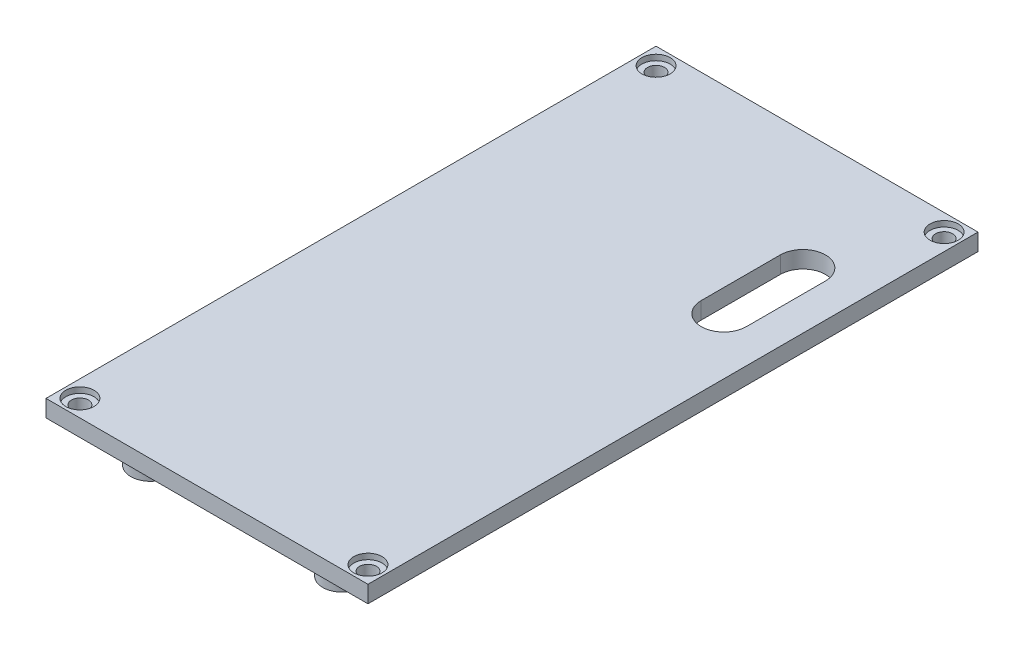
ISO-10303-21;
HEADER;
FILE_DESCRIPTION(('STEP AP214'),'2;1');
FILE_NAME('part.step','',(''),(''),'','','');
FILE_SCHEMA(('AUTOMOTIVE_DESIGN { 1 0 10303 214 1 1 1 1 }'));
ENDSEC;
DATA;
#1=APPLICATION_CONTEXT('core data for automotive mechanical design processes');
#2=APPLICATION_PROTOCOL_DEFINITION('international standard','automotive_design',2000,#1);
#3=PRODUCT_CONTEXT('',#1,'mechanical');
#4=PRODUCT('Part','Part','',(#3));
#5=PRODUCT_RELATED_PRODUCT_CATEGORY('part','',(#4));
#6=PRODUCT_DEFINITION_FORMATION('','',#4);
#7=PRODUCT_DEFINITION_CONTEXT('part definition',#1,'design');
#8=PRODUCT_DEFINITION('design','',#6,#7);
#9=PRODUCT_DEFINITION_SHAPE('','',#8);
#10=(LENGTH_UNIT() NAMED_UNIT(*) SI_UNIT(.MILLI.,.METRE.));
#11=(NAMED_UNIT(*) PLANE_ANGLE_UNIT() SI_UNIT($,.RADIAN.));
#12=(NAMED_UNIT(*) SI_UNIT($,.STERADIAN.) SOLID_ANGLE_UNIT());
#13=UNCERTAINTY_MEASURE_WITH_UNIT(LENGTH_MEASURE(1.E-05),#10,'distance_accuracy_value','');
#14=(GEOMETRIC_REPRESENTATION_CONTEXT(3) GLOBAL_UNCERTAINTY_ASSIGNED_CONTEXT((#13)) GLOBAL_UNIT_ASSIGNED_CONTEXT((#10,
#11,#12)) REPRESENTATION_CONTEXT('',''));
#15=CARTESIAN_POINT('',(0.,0.,0.));
#16=DIRECTION('',(0.,0.,1.));
#17=DIRECTION('',(1.,0.,0.));
#18=AXIS2_PLACEMENT_3D('',#15,#16,#17);
#19=CARTESIAN_POINT('',(-25.5,0.,-51.));
#20=DIRECTION('',(0.,1.,0.));
#21=DIRECTION('',(0.,0.,1.));
#22=AXIS2_PLACEMENT_3D('',#19,#20,#21);
#23=CYLINDRICAL_SURFACE('',#22,1.5);
#24=CARTESIAN_POINT('',(-25.5,0.,-51.));
#25=DIRECTION('',(0.,1.,0.));
#26=DIRECTION('',(0.,0.,1.));
#27=AXIS2_PLACEMENT_3D('',#24,#25,#26);
#28=CIRCLE('',#27,1.5);
#29=CARTESIAN_POINT('',(-25.5,0.,-49.5));
#30=VERTEX_POINT('',#29);
#31=EDGE_CURVE('E236',#30,#30,#28,.T.);
#32=ORIENTED_EDGE('',*,*,#31,.F.);
#33=EDGE_LOOP('',(#32));
#34=FACE_BOUND('',#33,.T.);
#35=CARTESIAN_POINT('',(-25.5,2.,-51.));
#36=DIRECTION('',(0.,1.,0.));
#37=DIRECTION('',(0.,0.,1.));
#38=AXIS2_PLACEMENT_3D('',#35,#36,#37);
#39=CIRCLE('',#38,1.5);
#40=CARTESIAN_POINT('',(-25.5,2.,-49.5));
#41=VERTEX_POINT('',#40);
#42=EDGE_CURVE('E245',#41,#41,#39,.F.);
#43=ORIENTED_EDGE('',*,*,#42,.F.);
#44=EDGE_LOOP('',(#43));
#45=FACE_BOUND('',#44,.T.);
#46=ADVANCED_FACE('F50',(#34,#45),#23,.F.);
#47=CARTESIAN_POINT('',(25.5,0.,-51.));
#48=DIRECTION('',(0.,1.,0.));
#49=DIRECTION('',(0.,0.,1.));
#50=AXIS2_PLACEMENT_3D('',#47,#48,#49);
#51=CYLINDRICAL_SURFACE('',#50,1.5);
#52=CARTESIAN_POINT('',(25.5,0.,-51.));
#53=DIRECTION('',(0.,1.,0.));
#54=DIRECTION('',(0.,0.,1.));
#55=AXIS2_PLACEMENT_3D('',#52,#53,#54);
#56=CIRCLE('',#55,1.5);
#57=CARTESIAN_POINT('',(25.5,0.,-49.5));
#58=VERTEX_POINT('',#57);
#59=EDGE_CURVE('E232',#58,#58,#56,.T.);
#60=ORIENTED_EDGE('',*,*,#59,.F.);
#61=EDGE_LOOP('',(#60));
#62=FACE_BOUND('',#61,.T.);
#63=CARTESIAN_POINT('',(25.5,2.,-51.));
#64=DIRECTION('',(0.,1.,0.));
#65=DIRECTION('',(0.,0.,1.));
#66=AXIS2_PLACEMENT_3D('',#63,#64,#65);
#67=CIRCLE('',#66,1.5);
#68=CARTESIAN_POINT('',(25.5,2.,-49.5));
#69=VERTEX_POINT('',#68);
#70=EDGE_CURVE('E299',#69,#69,#67,.F.);
#71=ORIENTED_EDGE('',*,*,#70,.F.);
#72=EDGE_LOOP('',(#71));
#73=FACE_BOUND('',#72,.T.);
#74=ADVANCED_FACE('F349',(#62,#73),#51,.F.);
#75=CARTESIAN_POINT('',(25.5,0.,51.));
#76=DIRECTION('',(0.,1.,0.));
#77=DIRECTION('',(0.,0.,1.));
#78=AXIS2_PLACEMENT_3D('',#75,#76,#77);
#79=CYLINDRICAL_SURFACE('',#78,1.5);
#80=CARTESIAN_POINT('',(25.5,0.,51.));
#81=DIRECTION('',(0.,1.,0.));
#82=DIRECTION('',(0.,0.,1.));
#83=AXIS2_PLACEMENT_3D('',#80,#81,#82);
#84=CIRCLE('',#83,1.5);
#85=CARTESIAN_POINT('',(25.5,0.,52.5));
#86=VERTEX_POINT('',#85);
#87=EDGE_CURVE('E237',#86,#86,#84,.T.);
#88=ORIENTED_EDGE('',*,*,#87,.F.);
#89=EDGE_LOOP('',(#88));
#90=FACE_BOUND('',#89,.T.);
#91=CARTESIAN_POINT('',(25.5,2.,51.));
#92=DIRECTION('',(0.,1.,0.));
#93=DIRECTION('',(0.,0.,1.));
#94=AXIS2_PLACEMENT_3D('',#91,#92,#93);
#95=CIRCLE('',#94,1.5);
#96=CARTESIAN_POINT('',(25.5,2.,52.5));
#97=VERTEX_POINT('',#96);
#98=EDGE_CURVE('E295',#97,#97,#95,.F.);
#99=ORIENTED_EDGE('',*,*,#98,.F.);
#100=EDGE_LOOP('',(#99));
#101=FACE_BOUND('',#100,.T.);
#102=ADVANCED_FACE('F355',(#90,#101),#79,.F.);
#103=CARTESIAN_POINT('',(-25.5,0.,51.));
#104=DIRECTION('',(0.,1.,0.));
#105=DIRECTION('',(0.,0.,1.));
#106=AXIS2_PLACEMENT_3D('',#103,#104,#105);
#107=CYLINDRICAL_SURFACE('',#106,1.5);
#108=CARTESIAN_POINT('',(-25.5,0.,51.));
#109=DIRECTION('',(0.,1.,0.));
#110=DIRECTION('',(0.,0.,1.));
#111=AXIS2_PLACEMENT_3D('',#108,#109,#110);
#112=CIRCLE('',#111,1.5);
#113=CARTESIAN_POINT('',(-25.5,0.,52.5));
#114=VERTEX_POINT('',#113);
#115=EDGE_CURVE('E241',#114,#114,#112,.T.);
#116=ORIENTED_EDGE('',*,*,#115,.F.);
#117=EDGE_LOOP('',(#116));
#118=FACE_BOUND('',#117,.T.);
#119=CARTESIAN_POINT('',(-25.5,2.,51.));
#120=DIRECTION('',(0.,1.,0.));
#121=DIRECTION('',(0.,0.,1.));
#122=AXIS2_PLACEMENT_3D('',#119,#120,#121);
#123=CIRCLE('',#122,1.5);
#124=CARTESIAN_POINT('',(-25.5,2.,52.5));
#125=VERTEX_POINT('',#124);
#126=EDGE_CURVE('E228',#125,#125,#123,.F.);
#127=ORIENTED_EDGE('',*,*,#126,.F.);
#128=EDGE_LOOP('',(#127));
#129=FACE_BOUND('',#128,.T.);
#130=ADVANCED_FACE('F362',(#118,#129),#107,.F.);
#131=CARTESIAN_POINT('',(-28.5,3.,-54.));
#132=DIRECTION('',(1.,0.,0.));
#133=DIRECTION('',(0.,0.,-1.));
#134=AXIS2_PLACEMENT_3D('',#131,#132,#133);
#135=PLANE('',#134);
#136=DIRECTION('',(0.,0.,1.));
#137=VECTOR('',#136,1.);
#138=CARTESIAN_POINT('',(-28.5,0.,-54.));
#139=LINE('',#138,#137);
#140=CARTESIAN_POINT('',(-28.5,0.,-54.));
#141=VERTEX_POINT('',#140);
#142=CARTESIAN_POINT('',(-28.5,0.,54.));
#143=VERTEX_POINT('',#142);
#144=EDGE_CURVE('E249',#141,#143,#139,.T.);
#145=ORIENTED_EDGE('',*,*,#144,.T.);
#146=DIRECTION('',(0.,-1.,0.));
#147=VECTOR('',#146,1.);
#148=CARTESIAN_POINT('',(-28.5,3.,54.));
#149=LINE('',#148,#147);
#150=CARTESIAN_POINT('',(-28.5,3.,54.));
#151=VERTEX_POINT('',#150);
#152=EDGE_CURVE('E287',#151,#143,#149,.T.);
#153=ORIENTED_EDGE('',*,*,#152,.F.);
#154=DIRECTION('',(0.,0.,1.));
#155=VECTOR('',#154,1.);
#156=CARTESIAN_POINT('',(-28.5,3.,-54.));
#157=LINE('',#156,#155);
#158=CARTESIAN_POINT('',(-28.5,3.,-54.));
#159=VERTEX_POINT('',#158);
#160=EDGE_CURVE('E250',#159,#151,#157,.T.);
#161=ORIENTED_EDGE('',*,*,#160,.F.);
#162=DIRECTION('',(0.,-1.,0.));
#163=VECTOR('',#162,1.);
#164=CARTESIAN_POINT('',(-28.5,3.,-54.));
#165=LINE('',#164,#163);
#166=EDGE_CURVE('E264',#159,#141,#165,.T.);
#167=ORIENTED_EDGE('',*,*,#166,.T.);
#168=EDGE_LOOP('',(#145,#153,#161,#167));
#169=FACE_BOUND('',#168,.T.);
#170=ADVANCED_FACE('F52',(#169),#135,.F.);
#171=CARTESIAN_POINT('',(-28.5,3.,54.));
#172=DIRECTION('',(0.,0.,-1.));
#173=DIRECTION('',(-1.,0.,0.));
#174=AXIS2_PLACEMENT_3D('',#171,#172,#173);
#175=PLANE('',#174);
#176=DIRECTION('',(1.,0.,0.));
#177=VECTOR('',#176,1.);
#178=CARTESIAN_POINT('',(-28.5,0.,54.));
#179=LINE('',#178,#177);
#180=CARTESIAN_POINT('',(28.5,0.,54.));
#181=VERTEX_POINT('',#180);
#182=EDGE_CURVE('E268',#143,#181,#179,.T.);
#183=ORIENTED_EDGE('',*,*,#182,.T.);
#184=DIRECTION('',(0.,-1.,0.));
#185=VECTOR('',#184,1.);
#186=CARTESIAN_POINT('',(28.5,3.,54.));
#187=LINE('',#186,#185);
#188=CARTESIAN_POINT('',(28.5,3.,54.));
#189=VERTEX_POINT('',#188);
#190=EDGE_CURVE('E283',#189,#181,#187,.T.);
#191=ORIENTED_EDGE('',*,*,#190,.F.);
#192=DIRECTION('',(1.,0.,0.));
#193=VECTOR('',#192,1.);
#194=CARTESIAN_POINT('',(-28.5,3.,54.));
#195=LINE('',#194,#193);
#196=EDGE_CURVE('E254',#151,#189,#195,.T.);
#197=ORIENTED_EDGE('',*,*,#196,.F.);
#198=ORIENTED_EDGE('',*,*,#152,.T.);
#199=EDGE_LOOP('',(#183,#191,#197,#198));
#200=FACE_BOUND('',#199,.T.);
#201=ADVANCED_FACE('F375',(#200),#175,.F.);
#202=CARTESIAN_POINT('',(28.5,3.,-54.));
#203=DIRECTION('',(-1.,0.,0.));
#204=DIRECTION('',(0.,0.,1.));
#205=AXIS2_PLACEMENT_3D('',#202,#203,#204);
#206=PLANE('',#205);
#207=DIRECTION('',(0.,0.,-1.));
#208=VECTOR('',#207,1.);
#209=CARTESIAN_POINT('',(28.5,0.,-54.));
#210=LINE('',#209,#208);
#211=CARTESIAN_POINT('',(28.5,0.,-54.));
#212=VERTEX_POINT('',#211);
#213=EDGE_CURVE('E271',#181,#212,#210,.T.);
#214=ORIENTED_EDGE('',*,*,#213,.T.);
#215=DIRECTION('',(0.,-1.,0.));
#216=VECTOR('',#215,1.);
#217=CARTESIAN_POINT('',(28.5,3.,-54.));
#218=LINE('',#217,#216);
#219=CARTESIAN_POINT('',(28.5,3.,-54.));
#220=VERTEX_POINT('',#219);
#221=EDGE_CURVE('E279',#220,#212,#218,.T.);
#222=ORIENTED_EDGE('',*,*,#221,.F.);
#223=DIRECTION('',(0.,0.,-1.));
#224=VECTOR('',#223,1.);
#225=CARTESIAN_POINT('',(28.5,3.,-54.));
#226=LINE('',#225,#224);
#227=EDGE_CURVE('E258',#189,#220,#226,.T.);
#228=ORIENTED_EDGE('',*,*,#227,.F.);
#229=ORIENTED_EDGE('',*,*,#190,.T.);
#230=EDGE_LOOP('',(#214,#222,#228,#229));
#231=FACE_BOUND('',#230,.T.);
#232=ADVANCED_FACE('F372',(#231),#206,.F.);
#233=CARTESIAN_POINT('',(-28.5,3.,-54.));
#234=DIRECTION('',(0.,0.,1.));
#235=DIRECTION('',(1.,0.,0.));
#236=AXIS2_PLACEMENT_3D('',#233,#234,#235);
#237=PLANE('',#236);
#238=DIRECTION('',(-1.,0.,0.));
#239=VECTOR('',#238,1.);
#240=CARTESIAN_POINT('',(-28.5,0.,-54.));
#241=LINE('',#240,#239);
#242=EDGE_CURVE('E255',#212,#141,#241,.T.);
#243=ORIENTED_EDGE('',*,*,#242,.T.);
#244=ORIENTED_EDGE('',*,*,#166,.F.);
#245=DIRECTION('',(-1.,0.,0.));
#246=VECTOR('',#245,1.);
#247=CARTESIAN_POINT('',(-28.5,3.,-54.));
#248=LINE('',#247,#246);
#249=EDGE_CURVE('E261',#220,#159,#248,.T.);
#250=ORIENTED_EDGE('',*,*,#249,.F.);
#251=ORIENTED_EDGE('',*,*,#221,.T.);
#252=EDGE_LOOP('',(#243,#244,#250,#251));
#253=FACE_BOUND('',#252,.T.);
#254=ADVANCED_FACE('F365',(#253),#237,.F.);
#255=CARTESIAN_POINT('',(0.,3.,0.));
#256=DIRECTION('',(0.,1.,0.));
#257=DIRECTION('',(0.,0.,1.));
#258=AXIS2_PLACEMENT_3D('',#255,#256,#257);
#259=PLANE('',#258);
#260=CARTESIAN_POINT('',(18.5,3.,-33.));
#261=DIRECTION('',(0.,1.,0.));
#262=DIRECTION('',(0.,0.,1.));
#263=AXIS2_PLACEMENT_3D('',#260,#261,#262);
#264=CIRCLE('',#263,4.);
#265=CARTESIAN_POINT('',(22.5,3.,-33.));
#266=VERTEX_POINT('',#265);
#267=CARTESIAN_POINT('',(14.5,3.,-33.));
#268=VERTEX_POINT('',#267);
#269=EDGE_CURVE('E66',#266,#268,#264,.T.);
#270=ORIENTED_EDGE('',*,*,#269,.F.);
#271=DIRECTION('',(0.,0.,-1.));
#272=VECTOR('',#271,1.);
#273=CARTESIAN_POINT('',(22.5,3.,-33.));
#274=LINE('',#273,#272);
#275=CARTESIAN_POINT('',(22.5,3.,-19.));
#276=VERTEX_POINT('',#275);
#277=EDGE_CURVE('E137',#276,#266,#274,.T.);
#278=ORIENTED_EDGE('',*,*,#277,.F.);
#279=CARTESIAN_POINT('',(18.5,3.,-19.));
#280=DIRECTION('',(0.,1.,0.));
#281=DIRECTION('',(0.,0.,1.));
#282=AXIS2_PLACEMENT_3D('',#279,#280,#281);
#283=CIRCLE('',#282,4.);
#284=CARTESIAN_POINT('',(14.5,3.,-19.));
#285=VERTEX_POINT('',#284);
#286=EDGE_CURVE('E119',#285,#276,#283,.T.);
#287=ORIENTED_EDGE('',*,*,#286,.F.);
#288=DIRECTION('',(0.,0.,1.));
#289=VECTOR('',#288,1.);
#290=CARTESIAN_POINT('',(14.5,3.,-33.));
#291=LINE('',#290,#289);
#292=EDGE_CURVE('E129',#268,#285,#291,.T.);
#293=ORIENTED_EDGE('',*,*,#292,.F.);
#294=EDGE_LOOP('',(#270,#278,#287,#293));
#295=FACE_BOUND('',#294,.T.);
#296=CARTESIAN_POINT('',(-25.5,3.,51.));
#297=DIRECTION('',(0.,1.,0.));
#298=DIRECTION('',(0.,0.,1.));
#299=AXIS2_PLACEMENT_3D('',#296,#297,#298);
#300=CIRCLE('',#299,2.5);
#301=CARTESIAN_POINT('',(-25.5,3.,53.5));
#302=VERTEX_POINT('',#301);
#303=EDGE_CURVE('E199',#302,#302,#300,.T.);
#304=ORIENTED_EDGE('',*,*,#303,.F.);
#305=EDGE_LOOP('',(#304));
#306=FACE_BOUND('',#305,.T.);
#307=CARTESIAN_POINT('',(25.5,3.,51.));
#308=DIRECTION('',(0.,1.,0.));
#309=DIRECTION('',(0.,0.,1.));
#310=AXIS2_PLACEMENT_3D('',#307,#308,#309);
#311=CIRCLE('',#310,2.5);
#312=CARTESIAN_POINT('',(25.5,3.,53.5));
#313=VERTEX_POINT('',#312);
#314=EDGE_CURVE('E213',#313,#313,#311,.T.);
#315=ORIENTED_EDGE('',*,*,#314,.F.);
#316=EDGE_LOOP('',(#315));
#317=FACE_BOUND('',#316,.T.);
#318=CARTESIAN_POINT('',(25.5,3.,-51.));
#319=DIRECTION('',(0.,1.,0.));
#320=DIRECTION('',(0.,0.,1.));
#321=AXIS2_PLACEMENT_3D('',#318,#319,#320);
#322=CIRCLE('',#321,2.5);
#323=CARTESIAN_POINT('',(25.5,3.,-48.5));
#324=VERTEX_POINT('',#323);
#325=EDGE_CURVE('E205',#324,#324,#322,.T.);
#326=ORIENTED_EDGE('',*,*,#325,.F.);
#327=EDGE_LOOP('',(#326));
#328=FACE_BOUND('',#327,.T.);
#329=CARTESIAN_POINT('',(-25.5,3.,-51.));
#330=DIRECTION('',(0.,1.,0.));
#331=DIRECTION('',(0.,0.,1.));
#332=AXIS2_PLACEMENT_3D('',#329,#330,#331);
#333=CIRCLE('',#332,2.5);
#334=CARTESIAN_POINT('',(-25.5,3.,-48.5));
#335=VERTEX_POINT('',#334);
#336=EDGE_CURVE('E204',#335,#335,#333,.T.);
#337=ORIENTED_EDGE('',*,*,#336,.F.);
#338=EDGE_LOOP('',(#337));
#339=FACE_BOUND('',#338,.T.);
#340=ORIENTED_EDGE('',*,*,#160,.T.);
#341=ORIENTED_EDGE('',*,*,#196,.T.);
#342=ORIENTED_EDGE('',*,*,#227,.T.);
#343=ORIENTED_EDGE('',*,*,#249,.T.);
#344=EDGE_LOOP('',(#340,#341,#342,#343));
#345=FACE_BOUND('',#344,.T.);
#346=ADVANCED_FACE('F134',(#295,#306,#317,#328,#339,#345),#259,.T.);
#347=CARTESIAN_POINT('',(0.,0.,0.));
#348=DIRECTION('',(0.,1.,0.));
#349=DIRECTION('',(0.,0.,1.));
#350=AXIS2_PLACEMENT_3D('',#347,#348,#349);
#351=PLANE('',#350);
#352=DIRECTION('',(0.,0.,-1.));
#353=VECTOR('',#352,1.);
#354=CARTESIAN_POINT('',(22.5,0.,0.));
#355=LINE('',#354,#353);
#356=CARTESIAN_POINT('',(22.5,0.,-19.));
#357=VERTEX_POINT('',#356);
#358=CARTESIAN_POINT('',(22.5,0.,-33.));
#359=VERTEX_POINT('',#358);
#360=EDGE_CURVE('E59',#357,#359,#355,.T.);
#361=ORIENTED_EDGE('',*,*,#360,.T.);
#362=CARTESIAN_POINT('',(18.5,0.,-33.));
#363=DIRECTION('',(0.,1.,0.));
#364=DIRECTION('',(0.,0.,1.));
#365=AXIS2_PLACEMENT_3D('',#362,#363,#364);
#366=CIRCLE('',#365,4.);
#367=CARTESIAN_POINT('',(14.5,0.,-33.));
#368=VERTEX_POINT('',#367);
#369=EDGE_CURVE('E13',#359,#368,#366,.T.);
#370=ORIENTED_EDGE('',*,*,#369,.T.);
#371=DIRECTION('',(0.,0.,1.));
#372=VECTOR('',#371,1.);
#373=CARTESIAN_POINT('',(14.5,0.,0.));
#374=LINE('',#373,#372);
#375=CARTESIAN_POINT('',(14.5,0.,-19.));
#376=VERTEX_POINT('',#375);
#377=EDGE_CURVE('E321',#368,#376,#374,.T.);
#378=ORIENTED_EDGE('',*,*,#377,.T.);
#379=CARTESIAN_POINT('',(18.5,0.,-19.));
#380=DIRECTION('',(0.,1.,0.));
#381=DIRECTION('',(0.,0.,1.));
#382=AXIS2_PLACEMENT_3D('',#379,#380,#381);
#383=CIRCLE('',#382,4.);
#384=EDGE_CURVE('E122',#376,#357,#383,.T.);
#385=ORIENTED_EDGE('',*,*,#384,.T.);
#386=EDGE_LOOP('',(#361,#370,#378,#385));
#387=FACE_BOUND('',#386,.T.);
#388=CARTESIAN_POINT('',(-17.,0.,-47.));
#389=DIRECTION('',(0.,1.,0.));
#390=DIRECTION('',(0.,0.,1.));
#391=AXIS2_PLACEMENT_3D('',#388,#389,#390);
#392=CIRCLE('',#391,3.5);
#393=CARTESIAN_POINT('',(-17.,0.,-43.5));
#394=VERTEX_POINT('',#393);
#395=EDGE_CURVE('E317',#394,#394,#392,.F.);
#396=ORIENTED_EDGE('',*,*,#395,.F.);
#397=EDGE_LOOP('',(#396));
#398=FACE_BOUND('',#397,.T.);
#399=CARTESIAN_POINT('',(17.,0.,-47.));
#400=DIRECTION('',(0.,1.,0.));
#401=DIRECTION('',(0.,0.,1.));
#402=AXIS2_PLACEMENT_3D('',#399,#400,#401);
#403=CIRCLE('',#402,3.5);
#404=CARTESIAN_POINT('',(17.,0.,-43.5));
#405=VERTEX_POINT('',#404);
#406=EDGE_CURVE('E313',#405,#405,#403,.F.);
#407=ORIENTED_EDGE('',*,*,#406,.F.);
#408=EDGE_LOOP('',(#407));
#409=FACE_BOUND('',#408,.T.);
#410=CARTESIAN_POINT('',(17.,0.,47.));
#411=DIRECTION('',(0.,1.,0.));
#412=DIRECTION('',(0.,0.,1.));
#413=AXIS2_PLACEMENT_3D('',#410,#411,#412);
#414=CIRCLE('',#413,3.5);
#415=CARTESIAN_POINT('',(17.,0.,50.5));
#416=VERTEX_POINT('',#415);
#417=EDGE_CURVE('E309',#416,#416,#414,.F.);
#418=ORIENTED_EDGE('',*,*,#417,.F.);
#419=EDGE_LOOP('',(#418));
#420=FACE_BOUND('',#419,.T.);
#421=CARTESIAN_POINT('',(-17.,0.,47.));
#422=DIRECTION('',(0.,1.,0.));
#423=DIRECTION('',(0.,0.,1.));
#424=AXIS2_PLACEMENT_3D('',#421,#422,#423);
#425=CIRCLE('',#424,3.5);
#426=CARTESIAN_POINT('',(-17.,0.,50.5));
#427=VERTEX_POINT('',#426);
#428=EDGE_CURVE('E291',#427,#427,#425,.F.);
#429=ORIENTED_EDGE('',*,*,#428,.F.);
#430=EDGE_LOOP('',(#429));
#431=FACE_BOUND('',#430,.T.);
#432=ORIENTED_EDGE('',*,*,#115,.T.);
#433=EDGE_LOOP('',(#432));
#434=FACE_BOUND('',#433,.T.);
#435=ORIENTED_EDGE('',*,*,#87,.T.);
#436=EDGE_LOOP('',(#435));
#437=FACE_BOUND('',#436,.T.);
#438=ORIENTED_EDGE('',*,*,#59,.T.);
#439=EDGE_LOOP('',(#438));
#440=FACE_BOUND('',#439,.T.);
#441=ORIENTED_EDGE('',*,*,#31,.T.);
#442=EDGE_LOOP('',(#441));
#443=FACE_BOUND('',#442,.T.);
#444=ORIENTED_EDGE('',*,*,#144,.F.);
#445=ORIENTED_EDGE('',*,*,#242,.F.);
#446=ORIENTED_EDGE('',*,*,#213,.F.);
#447=ORIENTED_EDGE('',*,*,#182,.F.);
#448=EDGE_LOOP('',(#444,#445,#446,#447));
#449=FACE_BOUND('',#448,.T.);
#450=ADVANCED_FACE('F328',(#387,#398,#409,#420,#431,#434,#437,#440,#443,#449),#351,.F.);
#451=CARTESIAN_POINT('',(-25.5,2.,51.));
#452=DIRECTION('',(0.,1.,0.));
#453=DIRECTION('',(0.,0.,1.));
#454=AXIS2_PLACEMENT_3D('',#451,#452,#453);
#455=PLANE('',#454);
#456=CARTESIAN_POINT('',(-25.5,2.,51.));
#457=DIRECTION('',(0.,1.,0.));
#458=DIRECTION('',(0.,0.,1.));
#459=AXIS2_PLACEMENT_3D('',#456,#457,#458);
#460=CIRCLE('',#459,2.5);
#461=CARTESIAN_POINT('',(-25.5,2.,53.5));
#462=VERTEX_POINT('',#461);
#463=EDGE_CURVE('E217',#462,#462,#460,.T.);
#464=ORIENTED_EDGE('',*,*,#463,.T.);
#465=EDGE_LOOP('',(#464));
#466=FACE_BOUND('',#465,.T.);
#467=ORIENTED_EDGE('',*,*,#126,.T.);
#468=EDGE_LOOP('',(#467));
#469=FACE_BOUND('',#468,.T.);
#470=ADVANCED_FACE('F368',(#466,#469),#455,.T.);
#471=CARTESIAN_POINT('',(-25.5,2.,51.));
#472=DIRECTION('',(0.,1.,0.));
#473=DIRECTION('',(0.,0.,1.));
#474=AXIS2_PLACEMENT_3D('',#471,#472,#473);
#475=CYLINDRICAL_SURFACE('',#474,2.5);
#476=ORIENTED_EDGE('',*,*,#463,.F.);
#477=EDGE_LOOP('',(#476));
#478=FACE_BOUND('',#477,.T.);
#479=ORIENTED_EDGE('',*,*,#303,.T.);
#480=EDGE_LOOP('',(#479));
#481=FACE_BOUND('',#480,.T.);
#482=ADVANCED_FACE('F408',(#478,#481),#475,.F.);
#483=CARTESIAN_POINT('',(25.5,2.,51.));
#484=DIRECTION('',(0.,1.,0.));
#485=DIRECTION('',(0.,0.,1.));
#486=AXIS2_PLACEMENT_3D('',#483,#484,#485);
#487=PLANE('',#486);
#488=CARTESIAN_POINT('',(25.5,2.,51.));
#489=DIRECTION('',(0.,1.,0.));
#490=DIRECTION('',(0.,0.,1.));
#491=AXIS2_PLACEMENT_3D('',#488,#489,#490);
#492=CIRCLE('',#491,2.5);
#493=CARTESIAN_POINT('',(25.5,2.,53.5));
#494=VERTEX_POINT('',#493);
#495=EDGE_CURVE('E209',#494,#494,#492,.T.);
#496=ORIENTED_EDGE('',*,*,#495,.T.);
#497=EDGE_LOOP('',(#496));
#498=FACE_BOUND('',#497,.T.);
#499=ORIENTED_EDGE('',*,*,#98,.T.);
#500=EDGE_LOOP('',(#499));
#501=FACE_BOUND('',#500,.T.);
#502=ADVANCED_FACE('F415',(#498,#501),#487,.T.);
#503=CARTESIAN_POINT('',(25.5,2.,51.));
#504=DIRECTION('',(0.,1.,0.));
#505=DIRECTION('',(0.,0.,1.));
#506=AXIS2_PLACEMENT_3D('',#503,#504,#505);
#507=CYLINDRICAL_SURFACE('',#506,2.5);
#508=ORIENTED_EDGE('',*,*,#495,.F.);
#509=EDGE_LOOP('',(#508));
#510=FACE_BOUND('',#509,.T.);
#511=ORIENTED_EDGE('',*,*,#314,.T.);
#512=EDGE_LOOP('',(#511));
#513=FACE_BOUND('',#512,.T.);
#514=ADVANCED_FACE('F419',(#510,#513),#507,.F.);
#515=CARTESIAN_POINT('',(25.5,2.,-51.));
#516=DIRECTION('',(0.,1.,0.));
#517=DIRECTION('',(0.,0.,1.));
#518=AXIS2_PLACEMENT_3D('',#515,#516,#517);
#519=PLANE('',#518);
#520=CARTESIAN_POINT('',(25.5,2.,-51.));
#521=DIRECTION('',(0.,1.,0.));
#522=DIRECTION('',(0.,0.,1.));
#523=AXIS2_PLACEMENT_3D('',#520,#521,#522);
#524=CIRCLE('',#523,2.5);
#525=CARTESIAN_POINT('',(25.5,2.,-48.5));
#526=VERTEX_POINT('',#525);
#527=EDGE_CURVE('E200',#526,#526,#524,.T.);
#528=ORIENTED_EDGE('',*,*,#527,.T.);
#529=EDGE_LOOP('',(#528));
#530=FACE_BOUND('',#529,.T.);
#531=ORIENTED_EDGE('',*,*,#70,.T.);
#532=EDGE_LOOP('',(#531));
#533=FACE_BOUND('',#532,.T.);
#534=ADVANCED_FACE('F453',(#530,#533),#519,.T.);
#535=CARTESIAN_POINT('',(25.5,2.,-51.));
#536=DIRECTION('',(0.,1.,0.));
#537=DIRECTION('',(0.,0.,1.));
#538=AXIS2_PLACEMENT_3D('',#535,#536,#537);
#539=CYLINDRICAL_SURFACE('',#538,2.5);
#540=ORIENTED_EDGE('',*,*,#527,.F.);
#541=EDGE_LOOP('',(#540));
#542=FACE_BOUND('',#541,.T.);
#543=ORIENTED_EDGE('',*,*,#325,.T.);
#544=EDGE_LOOP('',(#543));
#545=FACE_BOUND('',#544,.T.);
#546=ADVANCED_FACE('F426',(#542,#545),#539,.F.);
#547=CARTESIAN_POINT('',(-25.5,2.,-51.));
#548=DIRECTION('',(0.,1.,0.));
#549=DIRECTION('',(0.,0.,1.));
#550=AXIS2_PLACEMENT_3D('',#547,#548,#549);
#551=PLANE('',#550);
#552=CARTESIAN_POINT('',(-25.5,2.,-51.));
#553=DIRECTION('',(0.,1.,0.));
#554=DIRECTION('',(0.,0.,1.));
#555=AXIS2_PLACEMENT_3D('',#552,#553,#554);
#556=CIRCLE('',#555,2.5);
#557=CARTESIAN_POINT('',(-25.5,2.,-48.5));
#558=VERTEX_POINT('',#557);
#559=EDGE_CURVE('E224',#558,#558,#556,.T.);
#560=ORIENTED_EDGE('',*,*,#559,.T.);
#561=EDGE_LOOP('',(#560));
#562=FACE_BOUND('',#561,.T.);
#563=ORIENTED_EDGE('',*,*,#42,.T.);
#564=EDGE_LOOP('',(#563));
#565=FACE_BOUND('',#564,.T.);
#566=ADVANCED_FACE('F422',(#562,#565),#551,.T.);
#567=CARTESIAN_POINT('',(-25.5,2.,-51.));
#568=DIRECTION('',(0.,1.,0.));
#569=DIRECTION('',(0.,0.,1.));
#570=AXIS2_PLACEMENT_3D('',#567,#568,#569);
#571=CYLINDRICAL_SURFACE('',#570,2.5);
#572=ORIENTED_EDGE('',*,*,#559,.F.);
#573=EDGE_LOOP('',(#572));
#574=FACE_BOUND('',#573,.T.);
#575=ORIENTED_EDGE('',*,*,#336,.T.);
#576=EDGE_LOOP('',(#575));
#577=FACE_BOUND('',#576,.T.);
#578=ADVANCED_FACE('F425',(#574,#577),#571,.F.);
#579=CARTESIAN_POINT('',(-17.,-5.,47.));
#580=DIRECTION('',(0.,-1.,0.));
#581=DIRECTION('',(0.,0.,-1.));
#582=AXIS2_PLACEMENT_3D('',#579,#580,#581);
#583=PLANE('',#582);
#584=CARTESIAN_POINT('',(-17.,-5.,47.));
#585=DIRECTION('',(0.,-1.,0.));
#586=DIRECTION('',(0.,0.,-1.));
#587=AXIS2_PLACEMENT_3D('',#584,#585,#586);
#588=CIRCLE('',#587,3.5);
#589=CARTESIAN_POINT('',(-17.,-5.,43.5));
#590=VERTEX_POINT('',#589);
#591=EDGE_CURVE('E192',#590,#590,#588,.T.);
#592=ORIENTED_EDGE('',*,*,#591,.T.);
#593=EDGE_LOOP('',(#592));
#594=FACE_BOUND('',#593,.T.);
#595=CARTESIAN_POINT('',(-17.,-5.,47.));
#596=DIRECTION('',(0.,-1.,0.));
#597=DIRECTION('',(0.,0.,-1.));
#598=AXIS2_PLACEMENT_3D('',#595,#596,#597);
#599=CIRCLE('',#598,1.5);
#600=CARTESIAN_POINT('',(-17.,-5.,45.5));
#601=VERTEX_POINT('',#600);
#602=EDGE_CURVE('E188',#601,#601,#599,.T.);
#603=ORIENTED_EDGE('',*,*,#602,.F.);
#604=EDGE_LOOP('',(#603));
#605=FACE_BOUND('',#604,.T.);
#606=ADVANCED_FACE('F429',(#594,#605),#583,.T.);
#607=CARTESIAN_POINT('',(-17.,-5.,47.));
#608=DIRECTION('',(0.,1.,0.));
#609=DIRECTION('',(0.,0.,1.));
#610=AXIS2_PLACEMENT_3D('',#607,#608,#609);
#611=CYLINDRICAL_SURFACE('',#610,3.5);
#612=ORIENTED_EDGE('',*,*,#591,.F.);
#613=EDGE_LOOP('',(#612));
#614=FACE_BOUND('',#613,.T.);
#615=ORIENTED_EDGE('',*,*,#428,.T.);
#616=EDGE_LOOP('',(#615));
#617=FACE_BOUND('',#616,.T.);
#618=ADVANCED_FACE('F434',(#614,#617),#611,.T.);
#619=CARTESIAN_POINT('',(-17.,-5.,47.));
#620=DIRECTION('',(0.,1.,0.));
#621=DIRECTION('',(0.,0.,1.));
#622=AXIS2_PLACEMENT_3D('',#619,#620,#621);
#623=CYLINDRICAL_SURFACE('',#622,1.5);
#624=ORIENTED_EDGE('',*,*,#602,.T.);
#625=EDGE_LOOP('',(#624));
#626=FACE_BOUND('',#625,.T.);
#627=CARTESIAN_POINT('',(-17.,0.,47.));
#628=DIRECTION('',(0.,-1.,0.));
#629=DIRECTION('',(0.,0.,-1.));
#630=AXIS2_PLACEMENT_3D('',#627,#628,#629);
#631=CIRCLE('',#630,1.5);
#632=CARTESIAN_POINT('',(-17.,0.,45.5));
#633=VERTEX_POINT('',#632);
#634=EDGE_CURVE('E187',#633,#633,#631,.T.);
#635=ORIENTED_EDGE('',*,*,#634,.F.);
#636=EDGE_LOOP('',(#635));
#637=FACE_BOUND('',#636,.T.);
#638=ADVANCED_FACE('F446',(#626,#637),#623,.F.);
#639=ORIENTED_EDGE('',*,*,#634,.T.);
#640=EDGE_LOOP('',(#639));
#641=FACE_BOUND('',#640,.T.);
#642=ADVANCED_FACE('F369',(#641),#351,.F.);
#643=CARTESIAN_POINT('',(17.,-5.,47.));
#644=DIRECTION('',(0.,-1.,0.));
#645=DIRECTION('',(0.,0.,-1.));
#646=AXIS2_PLACEMENT_3D('',#643,#644,#645);
#647=PLANE('',#646);
#648=CARTESIAN_POINT('',(17.,-5.,47.));
#649=DIRECTION('',(0.,-1.,0.));
#650=DIRECTION('',(0.,0.,-1.));
#651=AXIS2_PLACEMENT_3D('',#648,#649,#650);
#652=CIRCLE('',#651,3.5);
#653=CARTESIAN_POINT('',(17.,-5.,43.5));
#654=VERTEX_POINT('',#653);
#655=EDGE_CURVE('E180',#654,#654,#652,.T.);
#656=ORIENTED_EDGE('',*,*,#655,.T.);
#657=EDGE_LOOP('',(#656));
#658=FACE_BOUND('',#657,.T.);
#659=CARTESIAN_POINT('',(17.,-5.,47.));
#660=DIRECTION('',(0.,-1.,0.));
#661=DIRECTION('',(0.,0.,-1.));
#662=AXIS2_PLACEMENT_3D('',#659,#660,#661);
#663=CIRCLE('',#662,1.5);
#664=CARTESIAN_POINT('',(17.,-5.,45.5));
#665=VERTEX_POINT('',#664);
#666=EDGE_CURVE('E176',#665,#665,#663,.T.);
#667=ORIENTED_EDGE('',*,*,#666,.F.);
#668=EDGE_LOOP('',(#667));
#669=FACE_BOUND('',#668,.T.);
#670=ADVANCED_FACE('F522',(#658,#669),#647,.T.);
#671=CARTESIAN_POINT('',(17.,-5.,47.));
#672=DIRECTION('',(0.,1.,0.));
#673=DIRECTION('',(0.,0.,1.));
#674=AXIS2_PLACEMENT_3D('',#671,#672,#673);
#675=CYLINDRICAL_SURFACE('',#674,3.5);
#676=ORIENTED_EDGE('',*,*,#655,.F.);
#677=EDGE_LOOP('',(#676));
#678=FACE_BOUND('',#677,.T.);
#679=ORIENTED_EDGE('',*,*,#417,.T.);
#680=EDGE_LOOP('',(#679));
#681=FACE_BOUND('',#680,.T.);
#682=ADVANCED_FACE('F532',(#678,#681),#675,.T.);
#683=CARTESIAN_POINT('',(17.,-5.,47.));
#684=DIRECTION('',(0.,1.,0.));
#685=DIRECTION('',(0.,0.,1.));
#686=AXIS2_PLACEMENT_3D('',#683,#684,#685);
#687=CYLINDRICAL_SURFACE('',#686,1.5);
#688=ORIENTED_EDGE('',*,*,#666,.T.);
#689=EDGE_LOOP('',(#688));
#690=FACE_BOUND('',#689,.T.);
#691=CARTESIAN_POINT('',(17.,0.,47.));
#692=DIRECTION('',(0.,-1.,0.));
#693=DIRECTION('',(0.,0.,-1.));
#694=AXIS2_PLACEMENT_3D('',#691,#692,#693);
#695=CIRCLE('',#694,1.5);
#696=CARTESIAN_POINT('',(17.,0.,45.5));
#697=VERTEX_POINT('',#696);
#698=EDGE_CURVE('E175',#697,#697,#695,.T.);
#699=ORIENTED_EDGE('',*,*,#698,.F.);
#700=EDGE_LOOP('',(#699));
#701=FACE_BOUND('',#700,.T.);
#702=ADVANCED_FACE('F542',(#690,#701),#687,.F.);
#703=ORIENTED_EDGE('',*,*,#698,.T.);
#704=EDGE_LOOP('',(#703));
#705=FACE_BOUND('',#704,.T.);
#706=ADVANCED_FACE('F524',(#705),#351,.F.);
#707=CARTESIAN_POINT('',(17.,-5.,-47.));
#708=DIRECTION('',(0.,-1.,0.));
#709=DIRECTION('',(0.,0.,-1.));
#710=AXIS2_PLACEMENT_3D('',#707,#708,#709);
#711=PLANE('',#710);
#712=CARTESIAN_POINT('',(17.,-5.,-47.));
#713=DIRECTION('',(0.,-1.,0.));
#714=DIRECTION('',(0.,0.,-1.));
#715=AXIS2_PLACEMENT_3D('',#712,#713,#714);
#716=CIRCLE('',#715,3.5);
#717=CARTESIAN_POINT('',(17.,-5.,-50.5));
#718=VERTEX_POINT('',#717);
#719=EDGE_CURVE('E168',#718,#718,#716,.T.);
#720=ORIENTED_EDGE('',*,*,#719,.T.);
#721=EDGE_LOOP('',(#720));
#722=FACE_BOUND('',#721,.T.);
#723=CARTESIAN_POINT('',(17.,-5.,-47.));
#724=DIRECTION('',(0.,-1.,0.));
#725=DIRECTION('',(0.,0.,-1.));
#726=AXIS2_PLACEMENT_3D('',#723,#724,#725);
#727=CIRCLE('',#726,1.5);
#728=CARTESIAN_POINT('',(17.,-5.,-48.5));
#729=VERTEX_POINT('',#728);
#730=EDGE_CURVE('E164',#729,#729,#727,.T.);
#731=ORIENTED_EDGE('',*,*,#730,.F.);
#732=EDGE_LOOP('',(#731));
#733=FACE_BOUND('',#732,.T.);
#734=ADVANCED_FACE('F560',(#722,#733),#711,.T.);
#735=CARTESIAN_POINT('',(17.,-5.,-47.));
#736=DIRECTION('',(0.,1.,0.));
#737=DIRECTION('',(0.,0.,1.));
#738=AXIS2_PLACEMENT_3D('',#735,#736,#737);
#739=CYLINDRICAL_SURFACE('',#738,3.5);
#740=ORIENTED_EDGE('',*,*,#719,.F.);
#741=EDGE_LOOP('',(#740));
#742=FACE_BOUND('',#741,.T.);
#743=ORIENTED_EDGE('',*,*,#406,.T.);
#744=EDGE_LOOP('',(#743));
#745=FACE_BOUND('',#744,.T.);
#746=ADVANCED_FACE('F569',(#742,#745),#739,.T.);
#747=CARTESIAN_POINT('',(17.,-5.,-47.));
#748=DIRECTION('',(0.,1.,0.));
#749=DIRECTION('',(0.,0.,1.));
#750=AXIS2_PLACEMENT_3D('',#747,#748,#749);
#751=CYLINDRICAL_SURFACE('',#750,1.5);
#752=ORIENTED_EDGE('',*,*,#730,.T.);
#753=EDGE_LOOP('',(#752));
#754=FACE_BOUND('',#753,.T.);
#755=CARTESIAN_POINT('',(17.,0.,-47.));
#756=DIRECTION('',(0.,-1.,0.));
#757=DIRECTION('',(0.,0.,-1.));
#758=AXIS2_PLACEMENT_3D('',#755,#756,#757);
#759=CIRCLE('',#758,1.5);
#760=CARTESIAN_POINT('',(17.,0.,-48.5));
#761=VERTEX_POINT('',#760);
#762=EDGE_CURVE('E163',#761,#761,#759,.T.);
#763=ORIENTED_EDGE('',*,*,#762,.F.);
#764=EDGE_LOOP('',(#763));
#765=FACE_BOUND('',#764,.T.);
#766=ADVANCED_FACE('F579',(#754,#765),#751,.F.);
#767=ORIENTED_EDGE('',*,*,#762,.T.);
#768=EDGE_LOOP('',(#767));
#769=FACE_BOUND('',#768,.T.);
#770=ADVANCED_FACE('F345',(#769),#351,.F.);
#771=CARTESIAN_POINT('',(-17.,-5.,-47.));
#772=DIRECTION('',(0.,-1.,0.));
#773=DIRECTION('',(0.,0.,-1.));
#774=AXIS2_PLACEMENT_3D('',#771,#772,#773);
#775=PLANE('',#774);
#776=CARTESIAN_POINT('',(-17.,-5.,-47.));
#777=DIRECTION('',(0.,-1.,0.));
#778=DIRECTION('',(0.,0.,-1.));
#779=AXIS2_PLACEMENT_3D('',#776,#777,#778);
#780=CIRCLE('',#779,3.5);
#781=CARTESIAN_POINT('',(-17.,-5.,-50.5));
#782=VERTEX_POINT('',#781);
#783=EDGE_CURVE('E156',#782,#782,#780,.T.);
#784=ORIENTED_EDGE('',*,*,#783,.T.);
#785=EDGE_LOOP('',(#784));
#786=FACE_BOUND('',#785,.T.);
#787=CARTESIAN_POINT('',(-17.,-5.,-47.));
#788=DIRECTION('',(0.,-1.,0.));
#789=DIRECTION('',(0.,0.,-1.));
#790=AXIS2_PLACEMENT_3D('',#787,#788,#789);
#791=CIRCLE('',#790,1.5);
#792=CARTESIAN_POINT('',(-17.,-5.,-48.5));
#793=VERTEX_POINT('',#792);
#794=EDGE_CURVE('E152',#793,#793,#791,.T.);
#795=ORIENTED_EDGE('',*,*,#794,.F.);
#796=EDGE_LOOP('',(#795));
#797=FACE_BOUND('',#796,.T.);
#798=ADVANCED_FACE('F598',(#786,#797),#775,.T.);
#799=CARTESIAN_POINT('',(-17.,-5.,-47.));
#800=DIRECTION('',(0.,1.,0.));
#801=DIRECTION('',(0.,0.,1.));
#802=AXIS2_PLACEMENT_3D('',#799,#800,#801);
#803=CYLINDRICAL_SURFACE('',#802,3.5);
#804=ORIENTED_EDGE('',*,*,#783,.F.);
#805=EDGE_LOOP('',(#804));
#806=FACE_BOUND('',#805,.T.);
#807=ORIENTED_EDGE('',*,*,#395,.T.);
#808=EDGE_LOOP('',(#807));
#809=FACE_BOUND('',#808,.T.);
#810=ADVANCED_FACE('F606',(#806,#809),#803,.T.);
#811=CARTESIAN_POINT('',(-17.,-5.,-47.));
#812=DIRECTION('',(0.,1.,0.));
#813=DIRECTION('',(0.,0.,1.));
#814=AXIS2_PLACEMENT_3D('',#811,#812,#813);
#815=CYLINDRICAL_SURFACE('',#814,1.5);
#816=ORIENTED_EDGE('',*,*,#794,.T.);
#817=EDGE_LOOP('',(#816));
#818=FACE_BOUND('',#817,.T.);
#819=CARTESIAN_POINT('',(-17.,0.,-47.));
#820=DIRECTION('',(0.,-1.,0.));
#821=DIRECTION('',(0.,0.,-1.));
#822=AXIS2_PLACEMENT_3D('',#819,#820,#821);
#823=CIRCLE('',#822,1.5);
#824=CARTESIAN_POINT('',(-17.,0.,-48.5));
#825=VERTEX_POINT('',#824);
#826=EDGE_CURVE('E147',#825,#825,#823,.T.);
#827=ORIENTED_EDGE('',*,*,#826,.F.);
#828=EDGE_LOOP('',(#827));
#829=FACE_BOUND('',#828,.T.);
#830=ADVANCED_FACE('F342',(#818,#829),#815,.F.);
#831=ORIENTED_EDGE('',*,*,#826,.T.);
#832=EDGE_LOOP('',(#831));
#833=FACE_BOUND('',#832,.T.);
#834=ADVANCED_FACE('F335',(#833),#351,.F.);
#835=CARTESIAN_POINT('',(18.5,-1.,-33.));
#836=DIRECTION('',(0.,1.,0.));
#837=DIRECTION('',(0.,0.,1.));
#838=AXIS2_PLACEMENT_3D('',#835,#836,#837);
#839=CYLINDRICAL_SURFACE('',#838,4.);
#840=DIRECTION('',(0.,1.,0.));
#841=VECTOR('',#840,1.);
#842=CARTESIAN_POINT('',(22.5,-1.,-33.));
#843=LINE('',#842,#841);
#844=EDGE_CURVE('E144',#359,#266,#843,.T.);
#845=ORIENTED_EDGE('',*,*,#844,.T.);
#846=ORIENTED_EDGE('',*,*,#269,.T.);
#847=DIRECTION('',(0.,1.,0.));
#848=VECTOR('',#847,1.);
#849=CARTESIAN_POINT('',(14.5,-1.,-33.));
#850=LINE('',#849,#848);
#851=EDGE_CURVE('E126',#368,#268,#850,.T.);
#852=ORIENTED_EDGE('',*,*,#851,.F.);
#853=ORIENTED_EDGE('',*,*,#369,.F.);
#854=EDGE_LOOP('',(#845,#846,#852,#853));
#855=FACE_BOUND('',#854,.T.);
#856=ADVANCED_FACE('F333',(#855),#839,.F.);
#857=CARTESIAN_POINT('',(22.5,-1.,-33.));
#858=DIRECTION('',(1.,0.,0.));
#859=DIRECTION('',(0.,0.,-1.));
#860=AXIS2_PLACEMENT_3D('',#857,#858,#859);
#861=PLANE('',#860);
#862=DIRECTION('',(0.,1.,0.));
#863=VECTOR('',#862,1.);
#864=CARTESIAN_POINT('',(22.5,-1.,-19.));
#865=LINE('',#864,#863);
#866=EDGE_CURVE('E125',#357,#276,#865,.T.);
#867=ORIENTED_EDGE('',*,*,#866,.T.);
#868=ORIENTED_EDGE('',*,*,#277,.T.);
#869=ORIENTED_EDGE('',*,*,#844,.F.);
#870=ORIENTED_EDGE('',*,*,#360,.F.);
#871=EDGE_LOOP('',(#867,#868,#869,#870));
#872=FACE_BOUND('',#871,.T.);
#873=ADVANCED_FACE('F332',(#872),#861,.F.);
#874=CARTESIAN_POINT('',(18.5,-1.,-19.));
#875=DIRECTION('',(0.,1.,0.));
#876=DIRECTION('',(0.,0.,1.));
#877=AXIS2_PLACEMENT_3D('',#874,#875,#876);
#878=CYLINDRICAL_SURFACE('',#877,4.);
#879=DIRECTION('',(0.,1.,0.));
#880=VECTOR('',#879,1.);
#881=CARTESIAN_POINT('',(14.5,-1.,-19.));
#882=LINE('',#881,#880);
#883=EDGE_CURVE('E74',#376,#285,#882,.T.);
#884=ORIENTED_EDGE('',*,*,#883,.T.);
#885=ORIENTED_EDGE('',*,*,#286,.T.);
#886=ORIENTED_EDGE('',*,*,#866,.F.);
#887=ORIENTED_EDGE('',*,*,#384,.F.);
#888=EDGE_LOOP('',(#884,#885,#886,#887));
#889=FACE_BOUND('',#888,.T.);
#890=ADVANCED_FACE('F116',(#889),#878,.F.);
#891=CARTESIAN_POINT('',(14.5,-1.,-33.));
#892=DIRECTION('',(-1.,0.,0.));
#893=DIRECTION('',(0.,0.,1.));
#894=AXIS2_PLACEMENT_3D('',#891,#892,#893);
#895=PLANE('',#894);
#896=ORIENTED_EDGE('',*,*,#851,.T.);
#897=ORIENTED_EDGE('',*,*,#292,.T.);
#898=ORIENTED_EDGE('',*,*,#883,.F.);
#899=ORIENTED_EDGE('',*,*,#377,.F.);
#900=EDGE_LOOP('',(#896,#897,#898,#899));
#901=FACE_BOUND('',#900,.T.);
#902=ADVANCED_FACE('F130',(#901),#895,.F.);
#903=CLOSED_SHELL('',(#46,#74,#102,#130,#170,#201,#232,#254,#346,#450,#470,#482,#502,#514,#534,
#546,#566,#578,#606,#618,#638,#642,#670,#682,#702,#706,#734,#746,#766,#770,#798,#810,#830,#834,
#856,#873,#890,#902));
#904=MANIFOLD_SOLID_BREP('B2',#903);
#905=ADVANCED_BREP_SHAPE_REPRESENTATION('',(#18,#904),#14);
#906=SHAPE_DEFINITION_REPRESENTATION(#9,#905);
ENDSEC;
END-ISO-10303-21;
